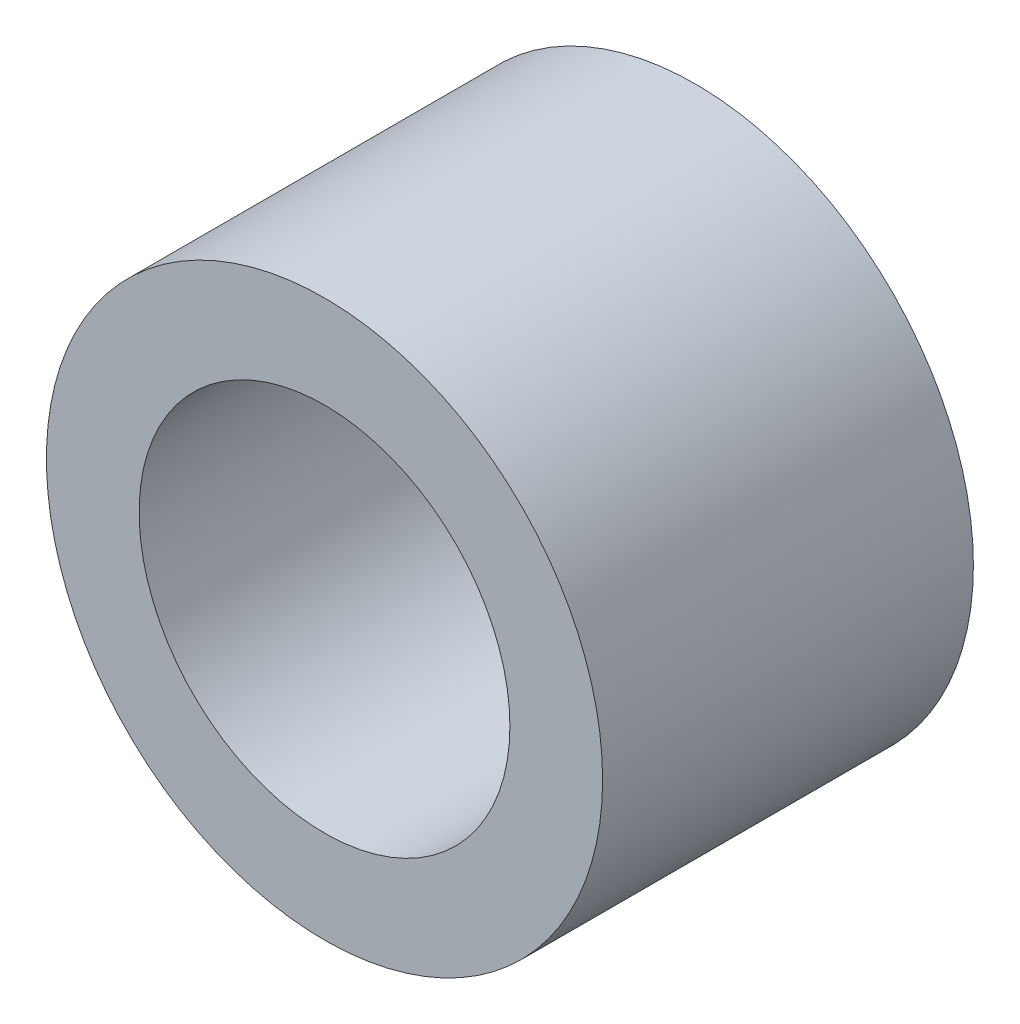
ISO-10303-21;
HEADER;
FILE_DESCRIPTION(('STEP AP214'),'2;1');
FILE_NAME('part.step','',(''),(''),'','','');
FILE_SCHEMA(('AUTOMOTIVE_DESIGN { 1 0 10303 214 1 1 1 1 }'));
ENDSEC;
DATA;
#1=APPLICATION_CONTEXT('core data for automotive mechanical design processes');
#2=APPLICATION_PROTOCOL_DEFINITION('international standard','automotive_design',2000,#1);
#3=PRODUCT_CONTEXT('',#1,'mechanical');
#4=PRODUCT('Part','Part','',(#3));
#5=PRODUCT_RELATED_PRODUCT_CATEGORY('part','',(#4));
#6=PRODUCT_DEFINITION_FORMATION('','',#4);
#7=PRODUCT_DEFINITION_CONTEXT('part definition',#1,'design');
#8=PRODUCT_DEFINITION('design','',#6,#7);
#9=PRODUCT_DEFINITION_SHAPE('','',#8);
#10=(LENGTH_UNIT() NAMED_UNIT(*) SI_UNIT(.MILLI.,.METRE.));
#11=(NAMED_UNIT(*) PLANE_ANGLE_UNIT() SI_UNIT($,.RADIAN.));
#12=(NAMED_UNIT(*) SI_UNIT($,.STERADIAN.) SOLID_ANGLE_UNIT());
#13=UNCERTAINTY_MEASURE_WITH_UNIT(LENGTH_MEASURE(1.E-05),#10,'distance_accuracy_value','');
#14=(GEOMETRIC_REPRESENTATION_CONTEXT(3) GLOBAL_UNCERTAINTY_ASSIGNED_CONTEXT((#13)) GLOBAL_UNIT_ASSIGNED_CONTEXT((#10,
#11,#12)) REPRESENTATION_CONTEXT('',''));
#15=CARTESIAN_POINT('',(0.,0.,0.));
#16=DIRECTION('',(0.,0.,1.));
#17=DIRECTION('',(1.,0.,0.));
#18=AXIS2_PLACEMENT_3D('',#15,#16,#17);
#19=CARTESIAN_POINT('',(0.,0.,12.7));
#20=DIRECTION('',(0.,0.,1.));
#21=DIRECTION('',(1.,0.,0.));
#22=AXIS2_PLACEMENT_3D('',#19,#20,#21);
#23=PLANE('',#22);
#24=CARTESIAN_POINT('',(0.,0.,12.7));
#25=DIRECTION('',(0.,0.,1.));
#26=DIRECTION('',(1.,0.,0.));
#27=AXIS2_PLACEMENT_3D('',#24,#25,#26);
#28=CIRCLE('',#27,9.525);
#29=CARTESIAN_POINT('',(9.525,0.,12.7));
#30=VERTEX_POINT('',#29);
#31=EDGE_CURVE('E10',#30,#30,#28,.T.);
#32=ORIENTED_EDGE('',*,*,#31,.T.);
#33=EDGE_LOOP('',(#32));
#34=FACE_BOUND('',#33,.T.);
#35=CARTESIAN_POINT('',(0.,0.,12.7));
#36=DIRECTION('',(0.,0.,1.));
#37=DIRECTION('',(1.,0.,0.));
#38=AXIS2_PLACEMENT_3D('',#35,#36,#37);
#39=CIRCLE('',#38,6.35);
#40=CARTESIAN_POINT('',(6.35,0.,12.7));
#41=VERTEX_POINT('',#40);
#42=EDGE_CURVE('E41',#41,#41,#39,.T.);
#43=ORIENTED_EDGE('',*,*,#42,.F.);
#44=EDGE_LOOP('',(#43));
#45=FACE_BOUND('',#44,.T.);
#46=ADVANCED_FACE('F30',(#34,#45),#23,.T.);
#47=CARTESIAN_POINT('',(0.,0.,0.));
#48=DIRECTION('',(0.,0.,1.));
#49=DIRECTION('',(1.,0.,0.));
#50=AXIS2_PLACEMENT_3D('',#47,#48,#49);
#51=PLANE('',#50);
#52=CARTESIAN_POINT('',(0.,0.,0.));
#53=DIRECTION('',(0.,0.,1.));
#54=DIRECTION('',(1.,0.,0.));
#55=AXIS2_PLACEMENT_3D('',#52,#53,#54);
#56=CIRCLE('',#55,9.525);
#57=CARTESIAN_POINT('',(9.525,0.,0.));
#58=VERTEX_POINT('',#57);
#59=EDGE_CURVE('E34',#58,#58,#56,.T.);
#60=ORIENTED_EDGE('',*,*,#59,.F.);
#61=EDGE_LOOP('',(#60));
#62=FACE_BOUND('',#61,.T.);
#63=CARTESIAN_POINT('',(0.,0.,0.));
#64=DIRECTION('',(0.,0.,1.));
#65=DIRECTION('',(1.,0.,0.));
#66=AXIS2_PLACEMENT_3D('',#63,#64,#65);
#67=CIRCLE('',#66,6.35);
#68=CARTESIAN_POINT('',(6.35,0.,0.));
#69=VERTEX_POINT('',#68);
#70=EDGE_CURVE('E43',#69,#69,#67,.T.);
#71=ORIENTED_EDGE('',*,*,#70,.T.);
#72=EDGE_LOOP('',(#71));
#73=FACE_BOUND('',#72,.T.);
#74=ADVANCED_FACE('F53',(#62,#73),#51,.F.);
#75=CARTESIAN_POINT('',(0.,0.,12.7));
#76=DIRECTION('',(0.,0.,-1.));
#77=DIRECTION('',(-1.,0.,0.));
#78=AXIS2_PLACEMENT_3D('',#75,#76,#77);
#79=CYLINDRICAL_SURFACE('',#78,9.525);
#80=ORIENTED_EDGE('',*,*,#31,.F.);
#81=EDGE_LOOP('',(#80));
#82=FACE_BOUND('',#81,.T.);
#83=ORIENTED_EDGE('',*,*,#59,.T.);
#84=EDGE_LOOP('',(#83));
#85=FACE_BOUND('',#84,.T.);
#86=ADVANCED_FACE('F32',(#82,#85),#79,.T.);
#87=CARTESIAN_POINT('',(0.,0.,12.7));
#88=DIRECTION('',(0.,0.,-1.));
#89=DIRECTION('',(-1.,0.,0.));
#90=AXIS2_PLACEMENT_3D('',#87,#88,#89);
#91=CYLINDRICAL_SURFACE('',#90,6.35);
#92=ORIENTED_EDGE('',*,*,#42,.T.);
#93=EDGE_LOOP('',(#92));
#94=FACE_BOUND('',#93,.T.);
#95=ORIENTED_EDGE('',*,*,#70,.F.);
#96=EDGE_LOOP('',(#95));
#97=FACE_BOUND('',#96,.T.);
#98=ADVANCED_FACE('F49',(#94,#97),#91,.F.);
#99=CLOSED_SHELL('',(#46,#74,#86,#98));
#100=MANIFOLD_SOLID_BREP('B2',#99);
#101=ADVANCED_BREP_SHAPE_REPRESENTATION('',(#18,#100),#14);
#102=SHAPE_DEFINITION_REPRESENTATION(#9,#101);
ENDSEC;
END-ISO-10303-21;
